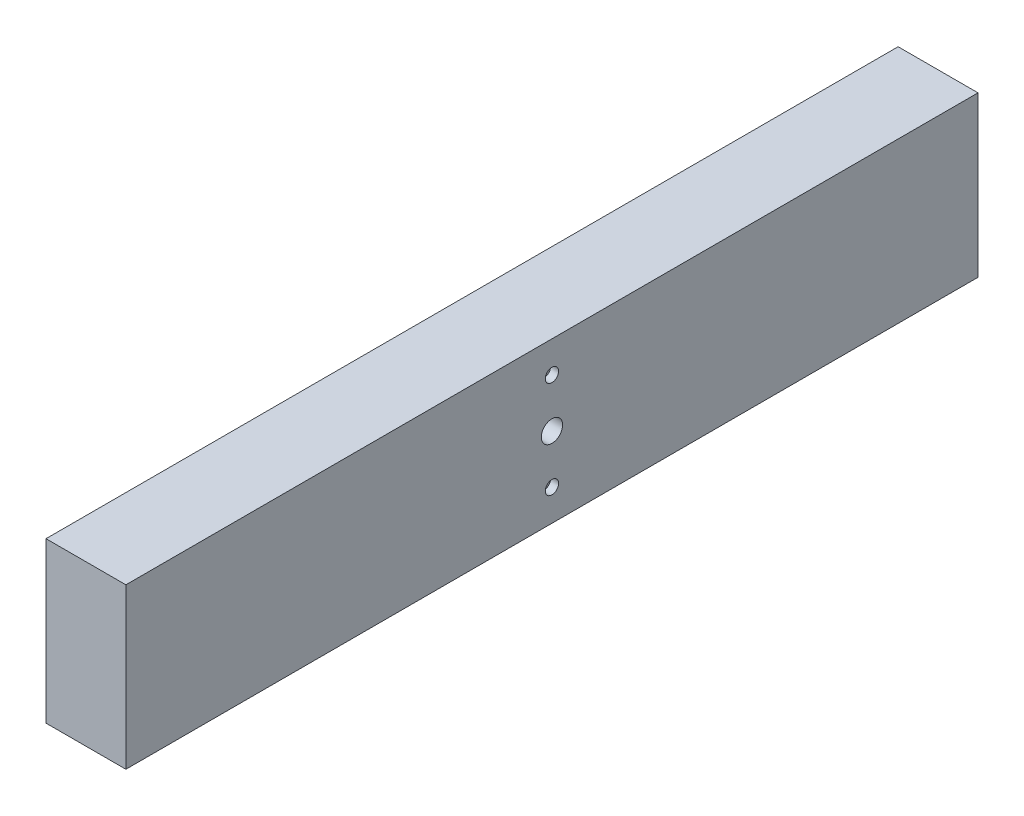
ISO-10303-21;
HEADER;
FILE_DESCRIPTION(('STEP AP214'),'2;1');
FILE_NAME('part.step','',(''),(''),'','','');
FILE_SCHEMA(('AUTOMOTIVE_DESIGN { 1 0 10303 214 1 1 1 1 }'));
ENDSEC;
DATA;
#1=APPLICATION_CONTEXT('core data for automotive mechanical design processes');
#2=APPLICATION_PROTOCOL_DEFINITION('international standard','automotive_design',2000,#1);
#3=PRODUCT_CONTEXT('',#1,'mechanical');
#4=PRODUCT('Part','Part','',(#3));
#5=PRODUCT_RELATED_PRODUCT_CATEGORY('part','',(#4));
#6=PRODUCT_DEFINITION_FORMATION('','',#4);
#7=PRODUCT_DEFINITION_CONTEXT('part definition',#1,'design');
#8=PRODUCT_DEFINITION('design','',#6,#7);
#9=PRODUCT_DEFINITION_SHAPE('','',#8);
#10=(LENGTH_UNIT() NAMED_UNIT(*) SI_UNIT(.MILLI.,.METRE.));
#11=(NAMED_UNIT(*) PLANE_ANGLE_UNIT() SI_UNIT($,.RADIAN.));
#12=(NAMED_UNIT(*) SI_UNIT($,.STERADIAN.) SOLID_ANGLE_UNIT());
#13=UNCERTAINTY_MEASURE_WITH_UNIT(LENGTH_MEASURE(1.E-05),#10,'distance_accuracy_value','');
#14=(GEOMETRIC_REPRESENTATION_CONTEXT(3) GLOBAL_UNCERTAINTY_ASSIGNED_CONTEXT((#13)) GLOBAL_UNIT_ASSIGNED_CONTEXT((#10,
#11,#12)) REPRESENTATION_CONTEXT('',''));
#15=CARTESIAN_POINT('',(0.,0.,0.));
#16=DIRECTION('',(0.,0.,1.));
#17=DIRECTION('',(1.,0.,0.));
#18=AXIS2_PLACEMENT_3D('',#15,#16,#17);
#19=CARTESIAN_POINT('',(15.,-30.,160.));
#20=DIRECTION('',(-1.,0.,0.));
#21=DIRECTION('',(0.,0.,1.));
#22=AXIS2_PLACEMENT_3D('',#19,#20,#21);
#23=PLANE('',#22);
#24=CARTESIAN_POINT('',(15.,0.,0.));
#25=DIRECTION('',(1.,0.,0.));
#26=DIRECTION('',(0.,0.,-1.));
#27=AXIS2_PLACEMENT_3D('',#24,#25,#26);
#28=CIRCLE('',#27,3.99999999999999);
#29=CARTESIAN_POINT('',(15.,0.,-3.99999999999999));
#30=VERTEX_POINT('',#29);
#31=EDGE_CURVE('E144',#30,#30,#28,.T.);
#32=ORIENTED_EDGE('',*,*,#31,.F.);
#33=EDGE_LOOP('',(#32));
#34=FACE_BOUND('',#33,.T.);
#35=CARTESIAN_POINT('',(15.,18.25,0.));
#36=DIRECTION('',(1.,0.,0.));
#37=DIRECTION('',(0.,0.,-1.));
#38=AXIS2_PLACEMENT_3D('',#35,#36,#37);
#39=CIRCLE('',#38,2.5);
#40=CARTESIAN_POINT('',(15.,18.25,-2.5));
#41=VERTEX_POINT('',#40);
#42=EDGE_CURVE('E137',#41,#41,#39,.T.);
#43=ORIENTED_EDGE('',*,*,#42,.F.);
#44=EDGE_LOOP('',(#43));
#45=FACE_BOUND('',#44,.T.);
#46=CARTESIAN_POINT('',(15.,-18.25,0.));
#47=DIRECTION('',(1.,0.,0.));
#48=DIRECTION('',(0.,0.,1.));
#49=AXIS2_PLACEMENT_3D('',#46,#47,#48);
#50=CIRCLE('',#49,2.5);
#51=CARTESIAN_POINT('',(15.,-18.25,2.5));
#52=VERTEX_POINT('',#51);
#53=EDGE_CURVE('E128',#52,#52,#50,.T.);
#54=ORIENTED_EDGE('',*,*,#53,.F.);
#55=EDGE_LOOP('',(#54));
#56=FACE_BOUND('',#55,.T.);
#57=DIRECTION('',(0.,1.,0.));
#58=VECTOR('',#57,1.);
#59=CARTESIAN_POINT('',(15.,-30.,-160.));
#60=LINE('',#59,#58);
#61=CARTESIAN_POINT('',(15.,-30.,-160.));
#62=VERTEX_POINT('',#61);
#63=CARTESIAN_POINT('',(15.,30.,-160.));
#64=VERTEX_POINT('',#63);
#65=EDGE_CURVE('E107',#62,#64,#60,.T.);
#66=ORIENTED_EDGE('',*,*,#65,.T.);
#67=DIRECTION('',(0.,0.,-1.));
#68=VECTOR('',#67,1.);
#69=CARTESIAN_POINT('',(15.,30.,160.));
#70=LINE('',#69,#68);
#71=CARTESIAN_POINT('',(15.,30.,160.));
#72=VERTEX_POINT('',#71);
#73=EDGE_CURVE('E11',#72,#64,#70,.T.);
#74=ORIENTED_EDGE('',*,*,#73,.F.);
#75=DIRECTION('',(0.,1.,0.));
#76=VECTOR('',#75,1.);
#77=CARTESIAN_POINT('',(15.,-30.,160.));
#78=LINE('',#77,#76);
#79=CARTESIAN_POINT('',(15.,-30.,160.));
#80=VERTEX_POINT('',#79);
#81=EDGE_CURVE('E91',#80,#72,#78,.T.);
#82=ORIENTED_EDGE('',*,*,#81,.F.);
#83=DIRECTION('',(0.,0.,-1.));
#84=VECTOR('',#83,1.);
#85=CARTESIAN_POINT('',(15.,-30.,160.));
#86=LINE('',#85,#84);
#87=EDGE_CURVE('E103',#80,#62,#86,.T.);
#88=ORIENTED_EDGE('',*,*,#87,.T.);
#89=EDGE_LOOP('',(#66,#74,#82,#88));
#90=FACE_BOUND('',#89,.T.);
#91=ADVANCED_FACE('F39',(#34,#45,#56,#90),#23,.F.);
#92=CARTESIAN_POINT('',(-15.,30.,160.));
#93=DIRECTION('',(0.,-1.,0.));
#94=DIRECTION('',(0.,0.,-1.));
#95=AXIS2_PLACEMENT_3D('',#92,#93,#94);
#96=PLANE('',#95);
#97=DIRECTION('',(-1.,0.,0.));
#98=VECTOR('',#97,1.);
#99=CARTESIAN_POINT('',(-15.,30.,-160.));
#100=LINE('',#99,#98);
#101=CARTESIAN_POINT('',(-15.,30.,-160.));
#102=VERTEX_POINT('',#101);
#103=EDGE_CURVE('E96',#64,#102,#100,.T.);
#104=ORIENTED_EDGE('',*,*,#103,.T.);
#105=DIRECTION('',(0.,0.,-1.));
#106=VECTOR('',#105,1.);
#107=CARTESIAN_POINT('',(-15.,30.,160.));
#108=LINE('',#107,#106);
#109=CARTESIAN_POINT('',(-15.,30.,160.));
#110=VERTEX_POINT('',#109);
#111=EDGE_CURVE('E48',#110,#102,#108,.T.);
#112=ORIENTED_EDGE('',*,*,#111,.F.);
#113=DIRECTION('',(-1.,0.,0.));
#114=VECTOR('',#113,1.);
#115=CARTESIAN_POINT('',(-15.,30.,160.));
#116=LINE('',#115,#114);
#117=EDGE_CURVE('E86',#72,#110,#116,.T.);
#118=ORIENTED_EDGE('',*,*,#117,.F.);
#119=ORIENTED_EDGE('',*,*,#73,.T.);
#120=EDGE_LOOP('',(#104,#112,#118,#119));
#121=FACE_BOUND('',#120,.T.);
#122=ADVANCED_FACE('F95',(#121),#96,.F.);
#123=CARTESIAN_POINT('',(-15.,-30.,160.));
#124=DIRECTION('',(1.,0.,0.));
#125=DIRECTION('',(0.,0.,-1.));
#126=AXIS2_PLACEMENT_3D('',#123,#124,#125);
#127=PLANE('',#126);
#128=DIRECTION('',(0.,-1.,0.));
#129=VECTOR('',#128,1.);
#130=CARTESIAN_POINT('',(-15.,-30.,-160.));
#131=LINE('',#130,#129);
#132=CARTESIAN_POINT('',(-15.,-30.,-160.));
#133=VERTEX_POINT('',#132);
#134=EDGE_CURVE('E73',#102,#133,#131,.T.);
#135=ORIENTED_EDGE('',*,*,#134,.T.);
#136=DIRECTION('',(0.,0.,-1.));
#137=VECTOR('',#136,1.);
#138=CARTESIAN_POINT('',(-15.,-30.,160.));
#139=LINE('',#138,#137);
#140=CARTESIAN_POINT('',(-15.,-30.,160.));
#141=VERTEX_POINT('',#140);
#142=EDGE_CURVE('E98',#141,#133,#139,.T.);
#143=ORIENTED_EDGE('',*,*,#142,.F.);
#144=DIRECTION('',(0.,-1.,0.));
#145=VECTOR('',#144,1.);
#146=CARTESIAN_POINT('',(-15.,-30.,160.));
#147=LINE('',#146,#145);
#148=EDGE_CURVE('E89',#110,#141,#147,.T.);
#149=ORIENTED_EDGE('',*,*,#148,.F.);
#150=ORIENTED_EDGE('',*,*,#111,.T.);
#151=EDGE_LOOP('',(#135,#143,#149,#150));
#152=FACE_BOUND('',#151,.T.);
#153=ADVANCED_FACE('F99',(#152),#127,.F.);
#154=CARTESIAN_POINT('',(-15.,-30.,160.));
#155=DIRECTION('',(0.,1.,0.));
#156=DIRECTION('',(0.,0.,1.));
#157=AXIS2_PLACEMENT_3D('',#154,#155,#156);
#158=PLANE('',#157);
#159=DIRECTION('',(1.,0.,0.));
#160=VECTOR('',#159,1.);
#161=CARTESIAN_POINT('',(-15.,-30.,-160.));
#162=LINE('',#161,#160);
#163=EDGE_CURVE('E79',#133,#62,#162,.T.);
#164=ORIENTED_EDGE('',*,*,#163,.T.);
#165=ORIENTED_EDGE('',*,*,#87,.F.);
#166=DIRECTION('',(1.,0.,0.));
#167=VECTOR('',#166,1.);
#168=CARTESIAN_POINT('',(-15.,-30.,160.));
#169=LINE('',#168,#167);
#170=EDGE_CURVE('E56',#141,#80,#169,.T.);
#171=ORIENTED_EDGE('',*,*,#170,.F.);
#172=ORIENTED_EDGE('',*,*,#142,.T.);
#173=EDGE_LOOP('',(#164,#165,#171,#172));
#174=FACE_BOUND('',#173,.T.);
#175=ADVANCED_FACE('F121',(#174),#158,.F.);
#176=CARTESIAN_POINT('',(0.,0.,160.));
#177=DIRECTION('',(0.,0.,-1.));
#178=DIRECTION('',(-1.,0.,0.));
#179=AXIS2_PLACEMENT_3D('',#176,#177,#178);
#180=PLANE('',#179);
#181=ORIENTED_EDGE('',*,*,#81,.T.);
#182=ORIENTED_EDGE('',*,*,#117,.T.);
#183=ORIENTED_EDGE('',*,*,#148,.T.);
#184=ORIENTED_EDGE('',*,*,#170,.T.);
#185=EDGE_LOOP('',(#181,#182,#183,#184));
#186=FACE_BOUND('',#185,.T.);
#187=ADVANCED_FACE('F87',(#186),#180,.F.);
#188=CARTESIAN_POINT('',(0.,0.,-160.));
#189=DIRECTION('',(0.,0.,-1.));
#190=DIRECTION('',(-1.,0.,0.));
#191=AXIS2_PLACEMENT_3D('',#188,#189,#190);
#192=PLANE('',#191);
#193=ORIENTED_EDGE('',*,*,#65,.F.);
#194=ORIENTED_EDGE('',*,*,#163,.F.);
#195=ORIENTED_EDGE('',*,*,#134,.F.);
#196=ORIENTED_EDGE('',*,*,#103,.F.);
#197=EDGE_LOOP('',(#193,#194,#195,#196));
#198=FACE_BOUND('',#197,.T.);
#199=ADVANCED_FACE('F124',(#198),#192,.T.);
#200=CARTESIAN_POINT('',(12.,-18.25,0.));
#201=DIRECTION('',(1.,0.,0.));
#202=DIRECTION('',(0.,0.,-1.));
#203=AXIS2_PLACEMENT_3D('',#200,#201,#202);
#204=CYLINDRICAL_SURFACE('',#203,2.5);
#205=CARTESIAN_POINT('',(12.,-18.25,0.));
#206=DIRECTION('',(1.,0.,0.));
#207=DIRECTION('',(0.,0.,1.));
#208=AXIS2_PLACEMENT_3D('',#205,#206,#207);
#209=CIRCLE('',#208,2.5);
#210=CARTESIAN_POINT('',(12.,-18.25,2.5));
#211=VERTEX_POINT('',#210);
#212=EDGE_CURVE('E132',#211,#211,#209,.T.);
#213=ORIENTED_EDGE('',*,*,#212,.F.);
#214=EDGE_LOOP('',(#213));
#215=FACE_BOUND('',#214,.T.);
#216=ORIENTED_EDGE('',*,*,#53,.T.);
#217=EDGE_LOOP('',(#216));
#218=FACE_BOUND('',#217,.T.);
#219=ADVANCED_FACE('F167',(#215,#218),#204,.F.);
#220=CARTESIAN_POINT('',(12.,-18.25,0.));
#221=DIRECTION('',(-1.,0.,0.));
#222=DIRECTION('',(0.,0.,1.));
#223=AXIS2_PLACEMENT_3D('',#220,#221,#222);
#224=PLANE('',#223);
#225=ORIENTED_EDGE('',*,*,#212,.T.);
#226=EDGE_LOOP('',(#225));
#227=FACE_BOUND('',#226,.T.);
#228=ADVANCED_FACE('F169',(#227),#224,.F.);
#229=CARTESIAN_POINT('',(12.,18.25,0.));
#230=DIRECTION('',(1.,0.,0.));
#231=DIRECTION('',(0.,0.,-1.));
#232=AXIS2_PLACEMENT_3D('',#229,#230,#231);
#233=CYLINDRICAL_SURFACE('',#232,2.5);
#234=CARTESIAN_POINT('',(12.,18.25,0.));
#235=DIRECTION('',(1.,0.,0.));
#236=DIRECTION('',(0.,0.,-1.));
#237=AXIS2_PLACEMENT_3D('',#234,#235,#236);
#238=CIRCLE('',#237,2.5);
#239=CARTESIAN_POINT('',(12.,18.25,-2.5));
#240=VERTEX_POINT('',#239);
#241=EDGE_CURVE('E111',#240,#240,#238,.T.);
#242=ORIENTED_EDGE('',*,*,#241,.F.);
#243=EDGE_LOOP('',(#242));
#244=FACE_BOUND('',#243,.T.);
#245=ORIENTED_EDGE('',*,*,#42,.T.);
#246=EDGE_LOOP('',(#245));
#247=FACE_BOUND('',#246,.T.);
#248=ADVANCED_FACE('F176',(#244,#247),#233,.F.);
#249=CARTESIAN_POINT('',(12.,18.25,0.));
#250=DIRECTION('',(1.,0.,0.));
#251=DIRECTION('',(0.,0.,-1.));
#252=AXIS2_PLACEMENT_3D('',#249,#250,#251);
#253=PLANE('',#252);
#254=ORIENTED_EDGE('',*,*,#241,.T.);
#255=EDGE_LOOP('',(#254));
#256=FACE_BOUND('',#255,.T.);
#257=ADVANCED_FACE('F157',(#256),#253,.T.);
#258=CARTESIAN_POINT('',(5.00000000000001,0.,0.));
#259=DIRECTION('',(1.,0.,0.));
#260=DIRECTION('',(0.,0.,-1.));
#261=AXIS2_PLACEMENT_3D('',#258,#259,#260);
#262=CYLINDRICAL_SURFACE('',#261,3.99999999999999);
#263=CARTESIAN_POINT('',(5.00000000000001,0.,0.));
#264=DIRECTION('',(1.,0.,0.));
#265=DIRECTION('',(0.,0.,-1.));
#266=AXIS2_PLACEMENT_3D('',#263,#264,#265);
#267=CIRCLE('',#266,3.99999999999999);
#268=CARTESIAN_POINT('',(5.00000000000001,0.,-3.99999999999999));
#269=VERTEX_POINT('',#268);
#270=EDGE_CURVE('E133',#269,#269,#267,.T.);
#271=ORIENTED_EDGE('',*,*,#270,.F.);
#272=EDGE_LOOP('',(#271));
#273=FACE_BOUND('',#272,.T.);
#274=ORIENTED_EDGE('',*,*,#31,.T.);
#275=EDGE_LOOP('',(#274));
#276=FACE_BOUND('',#275,.T.);
#277=ADVANCED_FACE('F154',(#273,#276),#262,.F.);
#278=CARTESIAN_POINT('',(5.00000000000001,0.,0.));
#279=DIRECTION('',(1.,0.,0.));
#280=DIRECTION('',(0.,0.,-1.));
#281=AXIS2_PLACEMENT_3D('',#278,#279,#280);
#282=PLANE('',#281);
#283=ORIENTED_EDGE('',*,*,#270,.T.);
#284=EDGE_LOOP('',(#283));
#285=FACE_BOUND('',#284,.T.);
#286=ADVANCED_FACE('F152',(#285),#282,.T.);
#287=CLOSED_SHELL('',(#91,#122,#153,#175,#187,#199,#219,#228,#248,#257,#277,#286));
#288=MANIFOLD_SOLID_BREP('B2',#287);
#289=ADVANCED_BREP_SHAPE_REPRESENTATION('',(#18,#288),#14);
#290=SHAPE_DEFINITION_REPRESENTATION(#9,#289);
ENDSEC;
END-ISO-10303-21;
